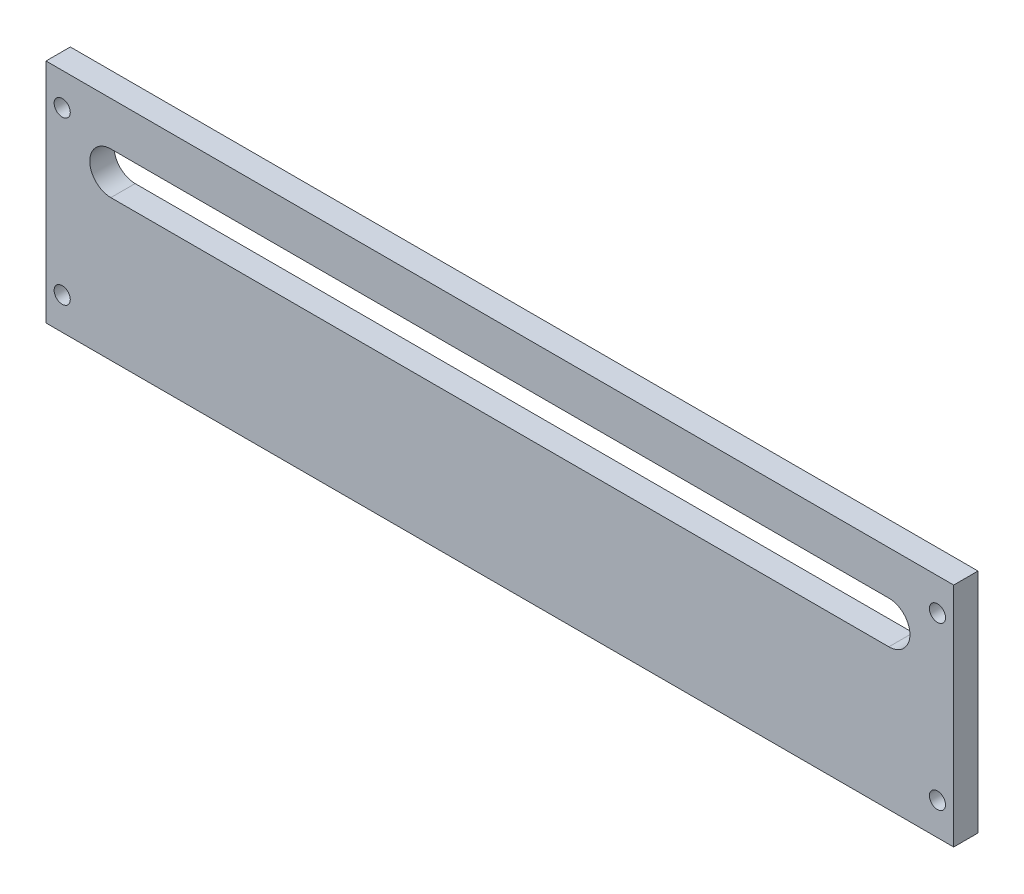
ISO-10303-21;
HEADER;
FILE_DESCRIPTION(('STEP AP214'),'2;1');
FILE_NAME('part.step','',(''),(''),'','','');
FILE_SCHEMA(('AUTOMOTIVE_DESIGN { 1 0 10303 214 1 1 1 1 }'));
ENDSEC;
DATA;
#1=APPLICATION_CONTEXT('core data for automotive mechanical design processes');
#2=APPLICATION_PROTOCOL_DEFINITION('international standard','automotive_design',2000,#1);
#3=PRODUCT_CONTEXT('',#1,'mechanical');
#4=PRODUCT('Part','Part','',(#3));
#5=PRODUCT_RELATED_PRODUCT_CATEGORY('part','',(#4));
#6=PRODUCT_DEFINITION_FORMATION('','',#4);
#7=PRODUCT_DEFINITION_CONTEXT('part definition',#1,'design');
#8=PRODUCT_DEFINITION('design','',#6,#7);
#9=PRODUCT_DEFINITION_SHAPE('','',#8);
#10=(LENGTH_UNIT() NAMED_UNIT(*) SI_UNIT(.MILLI.,.METRE.));
#11=(NAMED_UNIT(*) PLANE_ANGLE_UNIT() SI_UNIT($,.RADIAN.));
#12=(NAMED_UNIT(*) SI_UNIT($,.STERADIAN.) SOLID_ANGLE_UNIT());
#13=UNCERTAINTY_MEASURE_WITH_UNIT(LENGTH_MEASURE(1.E-05),#10,'distance_accuracy_value','');
#14=(GEOMETRIC_REPRESENTATION_CONTEXT(3) GLOBAL_UNCERTAINTY_ASSIGNED_CONTEXT((#13)) GLOBAL_UNIT_ASSIGNED_CONTEXT((#10,
#11,#12)) REPRESENTATION_CONTEXT('',''));
#15=CARTESIAN_POINT('',(0.,0.,0.));
#16=DIRECTION('',(0.,0.,1.));
#17=DIRECTION('',(1.,0.,0.));
#18=AXIS2_PLACEMENT_3D('',#15,#16,#17);
#19=CARTESIAN_POINT('',(0.,0.,9.525));
#20=DIRECTION('',(1.,0.,0.));
#21=DIRECTION('',(0.,0.,-1.));
#22=AXIS2_PLACEMENT_3D('',#19,#20,#21);
#23=PLANE('',#22);
#24=DIRECTION('',(0.,-1.,0.));
#25=VECTOR('',#24,1.);
#26=CARTESIAN_POINT('',(0.,0.,0.));
#27=LINE('',#26,#25);
#28=CARTESIAN_POINT('',(0.,88.9,0.));
#29=VERTEX_POINT('',#28);
#30=CARTESIAN_POINT('',(0.,0.,0.));
#31=VERTEX_POINT('',#30);
#32=EDGE_CURVE('E155',#29,#31,#27,.T.);
#33=ORIENTED_EDGE('',*,*,#32,.T.);
#34=DIRECTION('',(0.,0.,-1.));
#35=VECTOR('',#34,1.);
#36=CARTESIAN_POINT('',(0.,0.,9.525));
#37=LINE('',#36,#35);
#38=CARTESIAN_POINT('',(0.,0.,9.525));
#39=VERTEX_POINT('',#38);
#40=EDGE_CURVE('E11',#39,#31,#37,.T.);
#41=ORIENTED_EDGE('',*,*,#40,.F.);
#42=DIRECTION('',(0.,-1.,0.));
#43=VECTOR('',#42,1.);
#44=CARTESIAN_POINT('',(0.,0.,9.525));
#45=LINE('',#44,#43);
#46=CARTESIAN_POINT('',(0.,88.9,9.525));
#47=VERTEX_POINT('',#46);
#48=EDGE_CURVE('E158',#47,#39,#45,.T.);
#49=ORIENTED_EDGE('',*,*,#48,.F.);
#50=DIRECTION('',(0.,0.,-1.));
#51=VECTOR('',#50,1.);
#52=CARTESIAN_POINT('',(0.,88.9,9.525));
#53=LINE('',#52,#51);
#54=EDGE_CURVE('E168',#47,#29,#53,.T.);
#55=ORIENTED_EDGE('',*,*,#54,.T.);
#56=EDGE_LOOP('',(#33,#41,#49,#55));
#57=FACE_BOUND('',#56,.T.);
#58=ADVANCED_FACE('F33',(#57),#23,.F.);
#59=CARTESIAN_POINT('',(0.,0.,9.525));
#60=DIRECTION('',(0.,1.,0.));
#61=DIRECTION('',(0.,0.,1.));
#62=AXIS2_PLACEMENT_3D('',#59,#60,#61);
#63=PLANE('',#62);
#64=DIRECTION('',(1.,0.,0.));
#65=VECTOR('',#64,1.);
#66=CARTESIAN_POINT('',(0.,0.,0.));
#67=LINE('',#66,#65);
#68=CARTESIAN_POINT('',(355.6,0.,0.));
#69=VERTEX_POINT('',#68);
#70=EDGE_CURVE('E171',#31,#69,#67,.T.);
#71=ORIENTED_EDGE('',*,*,#70,.T.);
#72=DIRECTION('',(0.,0.,-1.));
#73=VECTOR('',#72,1.);
#74=CARTESIAN_POINT('',(355.6,0.,9.525));
#75=LINE('',#74,#73);
#76=CARTESIAN_POINT('',(355.6,0.,9.525));
#77=VERTEX_POINT('',#76);
#78=EDGE_CURVE('E40',#77,#69,#75,.T.);
#79=ORIENTED_EDGE('',*,*,#78,.F.);
#80=DIRECTION('',(1.,0.,0.));
#81=VECTOR('',#80,1.);
#82=CARTESIAN_POINT('',(0.,0.,9.525));
#83=LINE('',#82,#81);
#84=EDGE_CURVE('E161',#39,#77,#83,.T.);
#85=ORIENTED_EDGE('',*,*,#84,.F.);
#86=ORIENTED_EDGE('',*,*,#40,.T.);
#87=EDGE_LOOP('',(#71,#79,#85,#86));
#88=FACE_BOUND('',#87,.T.);
#89=ADVANCED_FACE('F200',(#88),#63,.F.);
#90=CARTESIAN_POINT('',(355.6,0.,9.525));
#91=DIRECTION('',(-1.,0.,0.));
#92=DIRECTION('',(0.,0.,1.));
#93=AXIS2_PLACEMENT_3D('',#90,#91,#92);
#94=PLANE('',#93);
#95=DIRECTION('',(0.,1.,0.));
#96=VECTOR('',#95,1.);
#97=CARTESIAN_POINT('',(355.6,0.,0.));
#98=LINE('',#97,#96);
#99=CARTESIAN_POINT('',(355.6,88.9,0.));
#100=VERTEX_POINT('',#99);
#101=EDGE_CURVE('E173',#69,#100,#98,.T.);
#102=ORIENTED_EDGE('',*,*,#101,.T.);
#103=DIRECTION('',(0.,0.,-1.));
#104=VECTOR('',#103,1.);
#105=CARTESIAN_POINT('',(355.6,88.9,9.525));
#106=LINE('',#105,#104);
#107=CARTESIAN_POINT('',(355.6,88.9,9.525));
#108=VERTEX_POINT('',#107);
#109=EDGE_CURVE('E178',#108,#100,#106,.T.);
#110=ORIENTED_EDGE('',*,*,#109,.F.);
#111=DIRECTION('',(0.,1.,0.));
#112=VECTOR('',#111,1.);
#113=CARTESIAN_POINT('',(355.6,0.,9.525));
#114=LINE('',#113,#112);
#115=EDGE_CURVE('E164',#77,#108,#114,.T.);
#116=ORIENTED_EDGE('',*,*,#115,.F.);
#117=ORIENTED_EDGE('',*,*,#78,.T.);
#118=EDGE_LOOP('',(#102,#110,#116,#117));
#119=FACE_BOUND('',#118,.T.);
#120=ADVANCED_FACE('F185',(#119),#94,.F.);
#121=CARTESIAN_POINT('',(0.,88.9,9.525));
#122=DIRECTION('',(0.,-1.,0.));
#123=DIRECTION('',(0.,0.,-1.));
#124=AXIS2_PLACEMENT_3D('',#121,#122,#123);
#125=PLANE('',#124);
#126=DIRECTION('',(-1.,0.,0.));
#127=VECTOR('',#126,1.);
#128=CARTESIAN_POINT('',(0.,88.9,0.));
#129=LINE('',#128,#127);
#130=EDGE_CURVE('E162',#100,#29,#129,.T.);
#131=ORIENTED_EDGE('',*,*,#130,.T.);
#132=ORIENTED_EDGE('',*,*,#54,.F.);
#133=DIRECTION('',(-1.,0.,0.));
#134=VECTOR('',#133,1.);
#135=CARTESIAN_POINT('',(0.,88.9,9.525));
#136=LINE('',#135,#134);
#137=EDGE_CURVE('E166',#108,#47,#136,.T.);
#138=ORIENTED_EDGE('',*,*,#137,.F.);
#139=ORIENTED_EDGE('',*,*,#109,.T.);
#140=EDGE_LOOP('',(#131,#132,#138,#139));
#141=FACE_BOUND('',#140,.T.);
#142=ADVANCED_FACE('F193',(#141),#125,.F.);
#143=CARTESIAN_POINT('',(0.,88.9,9.525));
#144=DIRECTION('',(0.,0.,-1.));
#145=DIRECTION('',(-1.,0.,0.));
#146=AXIS2_PLACEMENT_3D('',#143,#144,#145);
#147=PLANE('',#146);
#148=DIRECTION('',(1.,0.,0.));
#149=VECTOR('',#148,1.);
#150=CARTESIAN_POINT('',(25.4,55.245,9.525));
#151=LINE('',#150,#149);
#152=CARTESIAN_POINT('',(25.4,55.245,9.525));
#153=VERTEX_POINT('',#152);
#154=CARTESIAN_POINT('',(330.2,55.245,9.525));
#155=VERTEX_POINT('',#154);
#156=EDGE_CURVE('E124',#153,#155,#151,.T.);
#157=ORIENTED_EDGE('',*,*,#156,.F.);
#158=CARTESIAN_POINT('',(25.4,63.5,9.525));
#159=DIRECTION('',(0.,0.,1.));
#160=DIRECTION('',(1.,0.,0.));
#161=AXIS2_PLACEMENT_3D('',#158,#159,#160);
#162=CIRCLE('',#161,8.255);
#163=CARTESIAN_POINT('',(25.4,71.755,9.525));
#164=VERTEX_POINT('',#163);
#165=EDGE_CURVE('E47',#164,#153,#162,.T.);
#166=ORIENTED_EDGE('',*,*,#165,.F.);
#167=DIRECTION('',(-1.,0.,0.));
#168=VECTOR('',#167,1.);
#169=CARTESIAN_POINT('',(25.4,71.755,9.525));
#170=LINE('',#169,#168);
#171=CARTESIAN_POINT('',(330.2,71.755,9.525));
#172=VERTEX_POINT('',#171);
#173=EDGE_CURVE('E115',#172,#164,#170,.T.);
#174=ORIENTED_EDGE('',*,*,#173,.F.);
#175=CARTESIAN_POINT('',(330.2,63.5,9.525));
#176=DIRECTION('',(0.,0.,1.));
#177=DIRECTION('',(1.,0.,0.));
#178=AXIS2_PLACEMENT_3D('',#175,#176,#177);
#179=CIRCLE('',#178,8.255);
#180=EDGE_CURVE('E118',#155,#172,#179,.T.);
#181=ORIENTED_EDGE('',*,*,#180,.F.);
#182=EDGE_LOOP('',(#157,#166,#174,#181));
#183=FACE_BOUND('',#182,.T.);
#184=CARTESIAN_POINT('',(349.25,12.7,9.525));
#185=DIRECTION('',(0.,0.,1.));
#186=DIRECTION('',(1.,0.,0.));
#187=AXIS2_PLACEMENT_3D('',#184,#185,#186);
#188=CIRCLE('',#187,3.1623);
#189=CARTESIAN_POINT('',(352.4123,12.7,9.525));
#190=VERTEX_POINT('',#189);
#191=EDGE_CURVE('E130',#190,#190,#188,.T.);
#192=ORIENTED_EDGE('',*,*,#191,.F.);
#193=EDGE_LOOP('',(#192));
#194=FACE_BOUND('',#193,.T.);
#195=CARTESIAN_POINT('',(349.25,76.2,9.525));
#196=DIRECTION('',(0.,0.,1.));
#197=DIRECTION('',(1.,0.,0.));
#198=AXIS2_PLACEMENT_3D('',#195,#196,#197);
#199=CIRCLE('',#198,3.1623);
#200=CARTESIAN_POINT('',(352.4123,76.2,9.525));
#201=VERTEX_POINT('',#200);
#202=EDGE_CURVE('E137',#201,#201,#199,.T.);
#203=ORIENTED_EDGE('',*,*,#202,.F.);
#204=EDGE_LOOP('',(#203));
#205=FACE_BOUND('',#204,.T.);
#206=CARTESIAN_POINT('',(6.35,12.7,9.525));
#207=DIRECTION('',(0.,0.,1.));
#208=DIRECTION('',(1.,0.,0.));
#209=AXIS2_PLACEMENT_3D('',#206,#207,#208);
#210=CIRCLE('',#209,3.1623);
#211=CARTESIAN_POINT('',(9.5123,12.7,9.525));
#212=VERTEX_POINT('',#211);
#213=EDGE_CURVE('E143',#212,#212,#210,.T.);
#214=ORIENTED_EDGE('',*,*,#213,.F.);
#215=EDGE_LOOP('',(#214));
#216=FACE_BOUND('',#215,.T.);
#217=CARTESIAN_POINT('',(6.35,76.2,9.525));
#218=DIRECTION('',(0.,0.,1.));
#219=DIRECTION('',(1.,0.,0.));
#220=AXIS2_PLACEMENT_3D('',#217,#218,#219);
#221=CIRCLE('',#220,3.1623);
#222=CARTESIAN_POINT('',(9.5123,76.2,9.525));
#223=VERTEX_POINT('',#222);
#224=EDGE_CURVE('E149',#223,#223,#221,.T.);
#225=ORIENTED_EDGE('',*,*,#224,.F.);
#226=EDGE_LOOP('',(#225));
#227=FACE_BOUND('',#226,.T.);
#228=ORIENTED_EDGE('',*,*,#48,.T.);
#229=ORIENTED_EDGE('',*,*,#84,.T.);
#230=ORIENTED_EDGE('',*,*,#115,.T.);
#231=ORIENTED_EDGE('',*,*,#137,.T.);
#232=EDGE_LOOP('',(#228,#229,#230,#231));
#233=FACE_BOUND('',#232,.T.);
#234=ADVANCED_FACE('F199',(#183,#194,#205,#216,#227,#233),#147,.F.);
#235=CARTESIAN_POINT('',(0.,88.9,0.));
#236=DIRECTION('',(0.,0.,-1.));
#237=DIRECTION('',(-1.,0.,0.));
#238=AXIS2_PLACEMENT_3D('',#235,#236,#237);
#239=PLANE('',#238);
#240=CARTESIAN_POINT('',(25.4,63.5,0.));
#241=DIRECTION('',(0.,0.,1.));
#242=DIRECTION('',(1.,0.,0.));
#243=AXIS2_PLACEMENT_3D('',#240,#241,#242);
#244=CIRCLE('',#243,8.255);
#245=CARTESIAN_POINT('',(25.4,71.755,0.));
#246=VERTEX_POINT('',#245);
#247=CARTESIAN_POINT('',(25.4,55.245,0.));
#248=VERTEX_POINT('',#247);
#249=EDGE_CURVE('E99',#246,#248,#244,.T.);
#250=ORIENTED_EDGE('',*,*,#249,.T.);
#251=DIRECTION('',(1.,0.,0.));
#252=VECTOR('',#251,1.);
#253=CARTESIAN_POINT('',(25.4,55.245,0.));
#254=LINE('',#253,#252);
#255=CARTESIAN_POINT('',(330.2,55.245,0.));
#256=VERTEX_POINT('',#255);
#257=EDGE_CURVE('E108',#248,#256,#254,.T.);
#258=ORIENTED_EDGE('',*,*,#257,.T.);
#259=CARTESIAN_POINT('',(330.2,63.5,0.));
#260=DIRECTION('',(0.,0.,1.));
#261=DIRECTION('',(1.,0.,0.));
#262=AXIS2_PLACEMENT_3D('',#259,#260,#261);
#263=CIRCLE('',#262,8.255);
#264=CARTESIAN_POINT('',(330.2,71.755,0.));
#265=VERTEX_POINT('',#264);
#266=EDGE_CURVE('E55',#256,#265,#263,.T.);
#267=ORIENTED_EDGE('',*,*,#266,.T.);
#268=DIRECTION('',(-1.,0.,0.));
#269=VECTOR('',#268,1.);
#270=CARTESIAN_POINT('',(25.4,71.755,0.));
#271=LINE('',#270,#269);
#272=EDGE_CURVE('E105',#265,#246,#271,.T.);
#273=ORIENTED_EDGE('',*,*,#272,.T.);
#274=EDGE_LOOP('',(#250,#258,#267,#273));
#275=FACE_BOUND('',#274,.T.);
#276=CARTESIAN_POINT('',(349.25,12.7,0.));
#277=DIRECTION('',(0.,0.,1.));
#278=DIRECTION('',(1.,0.,0.));
#279=AXIS2_PLACEMENT_3D('',#276,#277,#278);
#280=CIRCLE('',#279,3.1623);
#281=CARTESIAN_POINT('',(352.4123,12.7,0.));
#282=VERTEX_POINT('',#281);
#283=EDGE_CURVE('E134',#282,#282,#280,.T.);
#284=ORIENTED_EDGE('',*,*,#283,.T.);
#285=EDGE_LOOP('',(#284));
#286=FACE_BOUND('',#285,.T.);
#287=CARTESIAN_POINT('',(349.25,76.2,0.));
#288=DIRECTION('',(0.,0.,1.));
#289=DIRECTION('',(1.,0.,0.));
#290=AXIS2_PLACEMENT_3D('',#287,#288,#289);
#291=CIRCLE('',#290,3.1623);
#292=CARTESIAN_POINT('',(352.4123,76.2,0.));
#293=VERTEX_POINT('',#292);
#294=EDGE_CURVE('E140',#293,#293,#291,.T.);
#295=ORIENTED_EDGE('',*,*,#294,.T.);
#296=EDGE_LOOP('',(#295));
#297=FACE_BOUND('',#296,.T.);
#298=CARTESIAN_POINT('',(6.35,12.7,0.));
#299=DIRECTION('',(0.,0.,1.));
#300=DIRECTION('',(1.,0.,0.));
#301=AXIS2_PLACEMENT_3D('',#298,#299,#300);
#302=CIRCLE('',#301,3.1623);
#303=CARTESIAN_POINT('',(9.5123,12.7,0.));
#304=VERTEX_POINT('',#303);
#305=EDGE_CURVE('E146',#304,#304,#302,.T.);
#306=ORIENTED_EDGE('',*,*,#305,.T.);
#307=EDGE_LOOP('',(#306));
#308=FACE_BOUND('',#307,.T.);
#309=CARTESIAN_POINT('',(6.35,76.2,0.));
#310=DIRECTION('',(0.,0.,1.));
#311=DIRECTION('',(1.,0.,0.));
#312=AXIS2_PLACEMENT_3D('',#309,#310,#311);
#313=CIRCLE('',#312,3.1623);
#314=CARTESIAN_POINT('',(9.5123,76.2,0.));
#315=VERTEX_POINT('',#314);
#316=EDGE_CURVE('E152',#315,#315,#313,.T.);
#317=ORIENTED_EDGE('',*,*,#316,.T.);
#318=EDGE_LOOP('',(#317));
#319=FACE_BOUND('',#318,.T.);
#320=ORIENTED_EDGE('',*,*,#32,.F.);
#321=ORIENTED_EDGE('',*,*,#130,.F.);
#322=ORIENTED_EDGE('',*,*,#101,.F.);
#323=ORIENTED_EDGE('',*,*,#70,.F.);
#324=EDGE_LOOP('',(#320,#321,#322,#323));
#325=FACE_BOUND('',#324,.T.);
#326=ADVANCED_FACE('F112',(#275,#286,#297,#308,#319,#325),#239,.T.);
#327=CARTESIAN_POINT('',(6.35,76.2,0.));
#328=DIRECTION('',(0.,0.,1.));
#329=DIRECTION('',(1.,0.,0.));
#330=AXIS2_PLACEMENT_3D('',#327,#328,#329);
#331=CYLINDRICAL_SURFACE('',#330,3.1623);
#332=CARTESIAN_POINT('',(9.5123,76.2,0.));
#333=CARTESIAN_POINT('',(9.5123,76.2,0.0992187499999999));
#334=CARTESIAN_POINT('',(9.5123,76.2,0.1984375));
#335=CARTESIAN_POINT('',(9.5123,76.2,0.396875));
#336=CARTESIAN_POINT('',(9.5123,76.2,0.49609375));
#337=CARTESIAN_POINT('',(9.5123,76.2,0.69453125));
#338=CARTESIAN_POINT('',(9.5123,76.2,0.79375));
#339=CARTESIAN_POINT('',(9.5123,76.2,0.9921875));
#340=CARTESIAN_POINT('',(9.5123,76.2,1.09140625));
#341=CARTESIAN_POINT('',(9.5123,76.2,1.28984375));
#342=CARTESIAN_POINT('',(9.5123,76.2,1.3890625));
#343=CARTESIAN_POINT('',(9.5123,76.2,1.5875));
#344=CARTESIAN_POINT('',(9.5123,76.2,1.68671875));
#345=CARTESIAN_POINT('',(9.5123,76.2,1.88515625));
#346=CARTESIAN_POINT('',(9.5123,76.2,1.984375));
#347=CARTESIAN_POINT('',(9.5123,76.2,2.1828125));
#348=CARTESIAN_POINT('',(9.5123,76.2,2.28203125));
#349=CARTESIAN_POINT('',(9.5123,76.2,2.48046875));
#350=CARTESIAN_POINT('',(9.5123,76.2,2.5796875));
#351=CARTESIAN_POINT('',(9.5123,76.2,2.778125));
#352=CARTESIAN_POINT('',(9.5123,76.2,2.87734375));
#353=CARTESIAN_POINT('',(9.5123,76.2,3.07578125));
#354=CARTESIAN_POINT('',(9.5123,76.2,3.175));
#355=CARTESIAN_POINT('',(9.5123,76.2,3.3734375));
#356=CARTESIAN_POINT('',(9.5123,76.2,3.47265625));
#357=CARTESIAN_POINT('',(9.5123,76.2,3.67109375));
#358=CARTESIAN_POINT('',(9.5123,76.2,3.7703125));
#359=CARTESIAN_POINT('',(9.5123,76.2,3.96875));
#360=CARTESIAN_POINT('',(9.5123,76.2,4.06796875));
#361=CARTESIAN_POINT('',(9.5123,76.2,4.26640625));
#362=CARTESIAN_POINT('',(9.5123,76.2,4.365625));
#363=CARTESIAN_POINT('',(9.5123,76.2,4.5640625));
#364=CARTESIAN_POINT('',(9.5123,76.2,4.66328125));
#365=CARTESIAN_POINT('',(9.5123,76.2,4.86171875));
#366=CARTESIAN_POINT('',(9.5123,76.2,4.9609375));
#367=CARTESIAN_POINT('',(9.5123,76.2,5.159375));
#368=CARTESIAN_POINT('',(9.5123,76.2,5.25859375));
#369=CARTESIAN_POINT('',(9.5123,76.2,5.45703125));
#370=CARTESIAN_POINT('',(9.5123,76.2,5.55625));
#371=CARTESIAN_POINT('',(9.5123,76.2,5.7546875));
#372=CARTESIAN_POINT('',(9.5123,76.2,5.85390625));
#373=CARTESIAN_POINT('',(9.5123,76.2,6.05234375));
#374=CARTESIAN_POINT('',(9.5123,76.2,6.1515625));
#375=CARTESIAN_POINT('',(9.5123,76.2,6.35));
#376=CARTESIAN_POINT('',(9.5123,76.2,6.44921875));
#377=CARTESIAN_POINT('',(9.5123,76.2,6.64765625));
#378=CARTESIAN_POINT('',(9.5123,76.2,6.746875));
#379=CARTESIAN_POINT('',(9.5123,76.2,6.9453125));
#380=CARTESIAN_POINT('',(9.5123,76.2,7.04453125));
#381=CARTESIAN_POINT('',(9.5123,76.2,7.24296875));
#382=CARTESIAN_POINT('',(9.5123,76.2,7.3421875));
#383=CARTESIAN_POINT('',(9.5123,76.2,7.540625));
#384=CARTESIAN_POINT('',(9.5123,76.2,7.63984375));
#385=CARTESIAN_POINT('',(9.5123,76.2,7.83828125));
#386=CARTESIAN_POINT('',(9.5123,76.2,7.9375));
#387=CARTESIAN_POINT('',(9.5123,76.2,8.1359375));
#388=CARTESIAN_POINT('',(9.5123,76.2,8.23515625));
#389=CARTESIAN_POINT('',(9.5123,76.2,8.43359375));
#390=CARTESIAN_POINT('',(9.5123,76.2,8.5328125));
#391=CARTESIAN_POINT('',(9.5123,76.2,8.73125));
#392=CARTESIAN_POINT('',(9.5123,76.2,8.83046875));
#393=CARTESIAN_POINT('',(9.5123,76.2,9.02890625));
#394=CARTESIAN_POINT('',(9.5123,76.2,9.128125));
#395=CARTESIAN_POINT('',(9.5123,76.2,9.3265625));
#396=CARTESIAN_POINT('',(9.5123,76.2,9.42578125));
#397=CARTESIAN_POINT('',(9.5123,76.2,9.525));
#398=B_SPLINE_CURVE_WITH_KNOTS('',3,(#332,#333,#334,#335,#336,#337,#338,#339,#340,#341,#342,
#343,#344,#345,#346,#347,#348,#349,#350,#351,#352,#353,#354,#355,#356,#357,#358,#359,#360,#361,
#362,#363,#364,#365,#366,#367,#368,#369,#370,#371,#372,#373,#374,#375,#376,#377,#378,#379,#380,
#381,#382,#383,#384,#385,#386,#387,#388,#389,#390,#391,#392,#393,#394,#395,#396,#397),
.UNSPECIFIED.,.F.,.F.,(4,2,2,2,2,2,2,2,2,2,2,2,2,2,2,2,2,2,2,2,2,2,2,2,2,2,2,2,2,2,2,2,4),(0.,
0.29765625,0.5953125,0.89296875,1.190625,1.48828125,1.7859375,2.08359375,2.38125,2.67890625,
2.9765625,3.27421875,3.571875,3.86953125,4.1671875,4.46484375,4.7625,5.06015625,5.3578125,
5.65546875,5.953125,6.25078125,6.5484375,6.84609375,7.14375,7.44140625,7.7390625,8.03671875,
8.334375,8.63203125,8.9296875,9.22734375,9.525),.UNSPECIFIED.);
#399=EDGE_CURVE('BSEAM212',#315,#223,#398,.T.);
#400=ORIENTED_EDGE('',*,*,#316,.F.);
#401=ORIENTED_EDGE('',*,*,#224,.T.);
#402=ORIENTED_EDGE('',*,*,#399,.T.);
#403=ORIENTED_EDGE('',*,*,#399,.F.);
#404=EDGE_LOOP('',(#400,#402,#401,#403));
#405=FACE_BOUND('',#404,.T.);
#406=ADVANCED_FACE('F212',(#405),#331,.F.);
#407=CARTESIAN_POINT('',(6.35,12.7,0.));
#408=DIRECTION('',(0.,0.,1.));
#409=DIRECTION('',(1.,0.,0.));
#410=AXIS2_PLACEMENT_3D('',#407,#408,#409);
#411=CYLINDRICAL_SURFACE('',#410,3.1623);
#412=CARTESIAN_POINT('',(9.5123,12.7,0.));
#413=CARTESIAN_POINT('',(9.5123,12.7,0.0992187499999999));
#414=CARTESIAN_POINT('',(9.5123,12.7,0.1984375));
#415=CARTESIAN_POINT('',(9.5123,12.7,0.396875));
#416=CARTESIAN_POINT('',(9.5123,12.7,0.49609375));
#417=CARTESIAN_POINT('',(9.5123,12.7,0.69453125));
#418=CARTESIAN_POINT('',(9.5123,12.7,0.79375));
#419=CARTESIAN_POINT('',(9.5123,12.7,0.9921875));
#420=CARTESIAN_POINT('',(9.5123,12.7,1.09140625));
#421=CARTESIAN_POINT('',(9.5123,12.7,1.28984375));
#422=CARTESIAN_POINT('',(9.5123,12.7,1.3890625));
#423=CARTESIAN_POINT('',(9.5123,12.7,1.5875));
#424=CARTESIAN_POINT('',(9.5123,12.7,1.68671875));
#425=CARTESIAN_POINT('',(9.5123,12.7,1.88515625));
#426=CARTESIAN_POINT('',(9.5123,12.7,1.984375));
#427=CARTESIAN_POINT('',(9.5123,12.7,2.1828125));
#428=CARTESIAN_POINT('',(9.5123,12.7,2.28203125));
#429=CARTESIAN_POINT('',(9.5123,12.7,2.48046875));
#430=CARTESIAN_POINT('',(9.5123,12.7,2.5796875));
#431=CARTESIAN_POINT('',(9.5123,12.7,2.778125));
#432=CARTESIAN_POINT('',(9.5123,12.7,2.87734375));
#433=CARTESIAN_POINT('',(9.5123,12.7,3.07578125));
#434=CARTESIAN_POINT('',(9.5123,12.7,3.175));
#435=CARTESIAN_POINT('',(9.5123,12.7,3.3734375));
#436=CARTESIAN_POINT('',(9.5123,12.7,3.47265625));
#437=CARTESIAN_POINT('',(9.5123,12.7,3.67109375));
#438=CARTESIAN_POINT('',(9.5123,12.7,3.7703125));
#439=CARTESIAN_POINT('',(9.5123,12.7,3.96875));
#440=CARTESIAN_POINT('',(9.5123,12.7,4.06796875));
#441=CARTESIAN_POINT('',(9.5123,12.7,4.26640625));
#442=CARTESIAN_POINT('',(9.5123,12.7,4.365625));
#443=CARTESIAN_POINT('',(9.5123,12.7,4.5640625));
#444=CARTESIAN_POINT('',(9.5123,12.7,4.66328125));
#445=CARTESIAN_POINT('',(9.5123,12.7,4.86171875));
#446=CARTESIAN_POINT('',(9.5123,12.7,4.9609375));
#447=CARTESIAN_POINT('',(9.5123,12.7,5.159375));
#448=CARTESIAN_POINT('',(9.5123,12.7,5.25859375));
#449=CARTESIAN_POINT('',(9.5123,12.7,5.45703125));
#450=CARTESIAN_POINT('',(9.5123,12.7,5.55625));
#451=CARTESIAN_POINT('',(9.5123,12.7,5.7546875));
#452=CARTESIAN_POINT('',(9.5123,12.7,5.85390625));
#453=CARTESIAN_POINT('',(9.5123,12.7,6.05234375));
#454=CARTESIAN_POINT('',(9.5123,12.7,6.1515625));
#455=CARTESIAN_POINT('',(9.5123,12.7,6.35));
#456=CARTESIAN_POINT('',(9.5123,12.7,6.44921875));
#457=CARTESIAN_POINT('',(9.5123,12.7,6.64765625));
#458=CARTESIAN_POINT('',(9.5123,12.7,6.746875));
#459=CARTESIAN_POINT('',(9.5123,12.7,6.9453125));
#460=CARTESIAN_POINT('',(9.5123,12.7,7.04453125));
#461=CARTESIAN_POINT('',(9.5123,12.7,7.24296875));
#462=CARTESIAN_POINT('',(9.5123,12.7,7.3421875));
#463=CARTESIAN_POINT('',(9.5123,12.7,7.540625));
#464=CARTESIAN_POINT('',(9.5123,12.7,7.63984375));
#465=CARTESIAN_POINT('',(9.5123,12.7,7.83828125));
#466=CARTESIAN_POINT('',(9.5123,12.7,7.9375));
#467=CARTESIAN_POINT('',(9.5123,12.7,8.1359375));
#468=CARTESIAN_POINT('',(9.5123,12.7,8.23515625));
#469=CARTESIAN_POINT('',(9.5123,12.7,8.43359375));
#470=CARTESIAN_POINT('',(9.5123,12.7,8.5328125));
#471=CARTESIAN_POINT('',(9.5123,12.7,8.73125));
#472=CARTESIAN_POINT('',(9.5123,12.7,8.83046875));
#473=CARTESIAN_POINT('',(9.5123,12.7,9.02890625));
#474=CARTESIAN_POINT('',(9.5123,12.7,9.128125));
#475=CARTESIAN_POINT('',(9.5123,12.7,9.3265625));
#476=CARTESIAN_POINT('',(9.5123,12.7,9.42578125));
#477=CARTESIAN_POINT('',(9.5123,12.7,9.525));
#478=B_SPLINE_CURVE_WITH_KNOTS('',3,(#412,#413,#414,#415,#416,#417,#418,#419,#420,#421,#422,
#423,#424,#425,#426,#427,#428,#429,#430,#431,#432,#433,#434,#435,#436,#437,#438,#439,#440,#441,
#442,#443,#444,#445,#446,#447,#448,#449,#450,#451,#452,#453,#454,#455,#456,#457,#458,#459,#460,
#461,#462,#463,#464,#465,#466,#467,#468,#469,#470,#471,#472,#473,#474,#475,#476,#477),
.UNSPECIFIED.,.F.,.F.,(4,2,2,2,2,2,2,2,2,2,2,2,2,2,2,2,2,2,2,2,2,2,2,2,2,2,2,2,2,2,2,2,4),(0.,
0.29765625,0.5953125,0.89296875,1.190625,1.48828125,1.7859375,2.08359375,2.38125,2.67890625,
2.9765625,3.27421875,3.571875,3.86953125,4.1671875,4.46484375,4.7625,5.06015625,5.3578125,
5.65546875,5.953125,6.25078125,6.5484375,6.84609375,7.14375,7.44140625,7.7390625,8.03671875,
8.334375,8.63203125,8.9296875,9.22734375,9.525),.UNSPECIFIED.);
#479=EDGE_CURVE('BSEAM218',#304,#212,#478,.T.);
#480=ORIENTED_EDGE('',*,*,#305,.F.);
#481=ORIENTED_EDGE('',*,*,#213,.T.);
#482=ORIENTED_EDGE('',*,*,#479,.T.);
#483=ORIENTED_EDGE('',*,*,#479,.F.);
#484=EDGE_LOOP('',(#480,#482,#481,#483));
#485=FACE_BOUND('',#484,.T.);
#486=ADVANCED_FACE('F218',(#485),#411,.F.);
#487=CARTESIAN_POINT('',(349.25,76.2,0.));
#488=DIRECTION('',(0.,0.,1.));
#489=DIRECTION('',(1.,0.,0.));
#490=AXIS2_PLACEMENT_3D('',#487,#488,#489);
#491=CYLINDRICAL_SURFACE('',#490,3.1623);
#492=CARTESIAN_POINT('',(352.4123,76.2,0.));
#493=CARTESIAN_POINT('',(352.4123,76.2,0.0992187499999999));
#494=CARTESIAN_POINT('',(352.4123,76.2,0.1984375));
#495=CARTESIAN_POINT('',(352.4123,76.2,0.396875));
#496=CARTESIAN_POINT('',(352.4123,76.2,0.49609375));
#497=CARTESIAN_POINT('',(352.4123,76.2,0.69453125));
#498=CARTESIAN_POINT('',(352.4123,76.2,0.79375));
#499=CARTESIAN_POINT('',(352.4123,76.2,0.9921875));
#500=CARTESIAN_POINT('',(352.4123,76.2,1.09140625));
#501=CARTESIAN_POINT('',(352.4123,76.2,1.28984375));
#502=CARTESIAN_POINT('',(352.4123,76.2,1.3890625));
#503=CARTESIAN_POINT('',(352.4123,76.2,1.5875));
#504=CARTESIAN_POINT('',(352.4123,76.2,1.68671875));
#505=CARTESIAN_POINT('',(352.4123,76.2,1.88515625));
#506=CARTESIAN_POINT('',(352.4123,76.2,1.984375));
#507=CARTESIAN_POINT('',(352.4123,76.2,2.1828125));
#508=CARTESIAN_POINT('',(352.4123,76.2,2.28203125));
#509=CARTESIAN_POINT('',(352.4123,76.2,2.48046875));
#510=CARTESIAN_POINT('',(352.4123,76.2,2.5796875));
#511=CARTESIAN_POINT('',(352.4123,76.2,2.778125));
#512=CARTESIAN_POINT('',(352.4123,76.2,2.87734375));
#513=CARTESIAN_POINT('',(352.4123,76.2,3.07578125));
#514=CARTESIAN_POINT('',(352.4123,76.2,3.175));
#515=CARTESIAN_POINT('',(352.4123,76.2,3.3734375));
#516=CARTESIAN_POINT('',(352.4123,76.2,3.47265625));
#517=CARTESIAN_POINT('',(352.4123,76.2,3.67109375));
#518=CARTESIAN_POINT('',(352.4123,76.2,3.7703125));
#519=CARTESIAN_POINT('',(352.4123,76.2,3.96875));
#520=CARTESIAN_POINT('',(352.4123,76.2,4.06796875));
#521=CARTESIAN_POINT('',(352.4123,76.2,4.26640625));
#522=CARTESIAN_POINT('',(352.4123,76.2,4.365625));
#523=CARTESIAN_POINT('',(352.4123,76.2,4.5640625));
#524=CARTESIAN_POINT('',(352.4123,76.2,4.66328125));
#525=CARTESIAN_POINT('',(352.4123,76.2,4.86171875));
#526=CARTESIAN_POINT('',(352.4123,76.2,4.9609375));
#527=CARTESIAN_POINT('',(352.4123,76.2,5.159375));
#528=CARTESIAN_POINT('',(352.4123,76.2,5.25859375));
#529=CARTESIAN_POINT('',(352.4123,76.2,5.45703125));
#530=CARTESIAN_POINT('',(352.4123,76.2,5.55625));
#531=CARTESIAN_POINT('',(352.4123,76.2,5.7546875));
#532=CARTESIAN_POINT('',(352.4123,76.2,5.85390625));
#533=CARTESIAN_POINT('',(352.4123,76.2,6.05234375));
#534=CARTESIAN_POINT('',(352.4123,76.2,6.1515625));
#535=CARTESIAN_POINT('',(352.4123,76.2,6.35));
#536=CARTESIAN_POINT('',(352.4123,76.2,6.44921875));
#537=CARTESIAN_POINT('',(352.4123,76.2,6.64765625));
#538=CARTESIAN_POINT('',(352.4123,76.2,6.746875));
#539=CARTESIAN_POINT('',(352.4123,76.2,6.9453125));
#540=CARTESIAN_POINT('',(352.4123,76.2,7.04453125));
#541=CARTESIAN_POINT('',(352.4123,76.2,7.24296875));
#542=CARTESIAN_POINT('',(352.4123,76.2,7.3421875));
#543=CARTESIAN_POINT('',(352.4123,76.2,7.540625));
#544=CARTESIAN_POINT('',(352.4123,76.2,7.63984375));
#545=CARTESIAN_POINT('',(352.4123,76.2,7.83828125));
#546=CARTESIAN_POINT('',(352.4123,76.2,7.9375));
#547=CARTESIAN_POINT('',(352.4123,76.2,8.1359375));
#548=CARTESIAN_POINT('',(352.4123,76.2,8.23515625));
#549=CARTESIAN_POINT('',(352.4123,76.2,8.43359375));
#550=CARTESIAN_POINT('',(352.4123,76.2,8.5328125));
#551=CARTESIAN_POINT('',(352.4123,76.2,8.73125));
#552=CARTESIAN_POINT('',(352.4123,76.2,8.83046875));
#553=CARTESIAN_POINT('',(352.4123,76.2,9.02890625));
#554=CARTESIAN_POINT('',(352.4123,76.2,9.128125));
#555=CARTESIAN_POINT('',(352.4123,76.2,9.3265625));
#556=CARTESIAN_POINT('',(352.4123,76.2,9.42578125));
#557=CARTESIAN_POINT('',(352.4123,76.2,9.525));
#558=B_SPLINE_CURVE_WITH_KNOTS('',3,(#492,#493,#494,#495,#496,#497,#498,#499,#500,#501,#502,
#503,#504,#505,#506,#507,#508,#509,#510,#511,#512,#513,#514,#515,#516,#517,#518,#519,#520,#521,
#522,#523,#524,#525,#526,#527,#528,#529,#530,#531,#532,#533,#534,#535,#536,#537,#538,#539,#540,
#541,#542,#543,#544,#545,#546,#547,#548,#549,#550,#551,#552,#553,#554,#555,#556,#557),
.UNSPECIFIED.,.F.,.F.,(4,2,2,2,2,2,2,2,2,2,2,2,2,2,2,2,2,2,2,2,2,2,2,2,2,2,2,2,2,2,2,2,4),(0.,
0.29765625,0.5953125,0.89296875,1.190625,1.48828125,1.7859375,2.08359375,2.38125,2.67890625,
2.9765625,3.27421875,3.571875,3.86953125,4.1671875,4.46484375,4.7625,5.06015625,5.3578125,
5.65546875,5.953125,6.25078125,6.5484375,6.84609375,7.14375,7.44140625,7.7390625,8.03671875,
8.334375,8.63203125,8.9296875,9.22734375,9.525),.UNSPECIFIED.);
#559=EDGE_CURVE('BSEAM222',#293,#201,#558,.T.);
#560=ORIENTED_EDGE('',*,*,#294,.F.);
#561=ORIENTED_EDGE('',*,*,#202,.T.);
#562=ORIENTED_EDGE('',*,*,#559,.T.);
#563=ORIENTED_EDGE('',*,*,#559,.F.);
#564=EDGE_LOOP('',(#560,#562,#561,#563));
#565=FACE_BOUND('',#564,.T.);
#566=ADVANCED_FACE('F222',(#565),#491,.F.);
#567=CARTESIAN_POINT('',(349.25,12.7,0.));
#568=DIRECTION('',(0.,0.,1.));
#569=DIRECTION('',(1.,0.,0.));
#570=AXIS2_PLACEMENT_3D('',#567,#568,#569);
#571=CYLINDRICAL_SURFACE('',#570,3.1623);
#572=CARTESIAN_POINT('',(352.4123,12.7,0.));
#573=CARTESIAN_POINT('',(352.4123,12.7,0.0992187499999999));
#574=CARTESIAN_POINT('',(352.4123,12.7,0.1984375));
#575=CARTESIAN_POINT('',(352.4123,12.7,0.396875));
#576=CARTESIAN_POINT('',(352.4123,12.7,0.49609375));
#577=CARTESIAN_POINT('',(352.4123,12.7,0.69453125));
#578=CARTESIAN_POINT('',(352.4123,12.7,0.79375));
#579=CARTESIAN_POINT('',(352.4123,12.7,0.9921875));
#580=CARTESIAN_POINT('',(352.4123,12.7,1.09140625));
#581=CARTESIAN_POINT('',(352.4123,12.7,1.28984375));
#582=CARTESIAN_POINT('',(352.4123,12.7,1.3890625));
#583=CARTESIAN_POINT('',(352.4123,12.7,1.5875));
#584=CARTESIAN_POINT('',(352.4123,12.7,1.68671875));
#585=CARTESIAN_POINT('',(352.4123,12.7,1.88515625));
#586=CARTESIAN_POINT('',(352.4123,12.7,1.984375));
#587=CARTESIAN_POINT('',(352.4123,12.7,2.1828125));
#588=CARTESIAN_POINT('',(352.4123,12.7,2.28203125));
#589=CARTESIAN_POINT('',(352.4123,12.7,2.48046875));
#590=CARTESIAN_POINT('',(352.4123,12.7,2.5796875));
#591=CARTESIAN_POINT('',(352.4123,12.7,2.778125));
#592=CARTESIAN_POINT('',(352.4123,12.7,2.87734375));
#593=CARTESIAN_POINT('',(352.4123,12.7,3.07578125));
#594=CARTESIAN_POINT('',(352.4123,12.7,3.175));
#595=CARTESIAN_POINT('',(352.4123,12.7,3.3734375));
#596=CARTESIAN_POINT('',(352.4123,12.7,3.47265625));
#597=CARTESIAN_POINT('',(352.4123,12.7,3.67109375));
#598=CARTESIAN_POINT('',(352.4123,12.7,3.7703125));
#599=CARTESIAN_POINT('',(352.4123,12.7,3.96875));
#600=CARTESIAN_POINT('',(352.4123,12.7,4.06796875));
#601=CARTESIAN_POINT('',(352.4123,12.7,4.26640625));
#602=CARTESIAN_POINT('',(352.4123,12.7,4.365625));
#603=CARTESIAN_POINT('',(352.4123,12.7,4.5640625));
#604=CARTESIAN_POINT('',(352.4123,12.7,4.66328125));
#605=CARTESIAN_POINT('',(352.4123,12.7,4.86171875));
#606=CARTESIAN_POINT('',(352.4123,12.7,4.9609375));
#607=CARTESIAN_POINT('',(352.4123,12.7,5.159375));
#608=CARTESIAN_POINT('',(352.4123,12.7,5.25859375));
#609=CARTESIAN_POINT('',(352.4123,12.7,5.45703125));
#610=CARTESIAN_POINT('',(352.4123,12.7,5.55625));
#611=CARTESIAN_POINT('',(352.4123,12.7,5.7546875));
#612=CARTESIAN_POINT('',(352.4123,12.7,5.85390625));
#613=CARTESIAN_POINT('',(352.4123,12.7,6.05234375));
#614=CARTESIAN_POINT('',(352.4123,12.7,6.1515625));
#615=CARTESIAN_POINT('',(352.4123,12.7,6.35));
#616=CARTESIAN_POINT('',(352.4123,12.7,6.44921875));
#617=CARTESIAN_POINT('',(352.4123,12.7,6.64765625));
#618=CARTESIAN_POINT('',(352.4123,12.7,6.746875));
#619=CARTESIAN_POINT('',(352.4123,12.7,6.9453125));
#620=CARTESIAN_POINT('',(352.4123,12.7,7.04453125));
#621=CARTESIAN_POINT('',(352.4123,12.7,7.24296875));
#622=CARTESIAN_POINT('',(352.4123,12.7,7.3421875));
#623=CARTESIAN_POINT('',(352.4123,12.7,7.540625));
#624=CARTESIAN_POINT('',(352.4123,12.7,7.63984375));
#625=CARTESIAN_POINT('',(352.4123,12.7,7.83828125));
#626=CARTESIAN_POINT('',(352.4123,12.7,7.9375));
#627=CARTESIAN_POINT('',(352.4123,12.7,8.1359375));
#628=CARTESIAN_POINT('',(352.4123,12.7,8.23515625));
#629=CARTESIAN_POINT('',(352.4123,12.7,8.43359375));
#630=CARTESIAN_POINT('',(352.4123,12.7,8.5328125));
#631=CARTESIAN_POINT('',(352.4123,12.7,8.73125));
#632=CARTESIAN_POINT('',(352.4123,12.7,8.83046875));
#633=CARTESIAN_POINT('',(352.4123,12.7,9.02890625));
#634=CARTESIAN_POINT('',(352.4123,12.7,9.128125));
#635=CARTESIAN_POINT('',(352.4123,12.7,9.3265625));
#636=CARTESIAN_POINT('',(352.4123,12.7,9.42578125));
#637=CARTESIAN_POINT('',(352.4123,12.7,9.525));
#638=B_SPLINE_CURVE_WITH_KNOTS('',3,(#572,#573,#574,#575,#576,#577,#578,#579,#580,#581,#582,
#583,#584,#585,#586,#587,#588,#589,#590,#591,#592,#593,#594,#595,#596,#597,#598,#599,#600,#601,
#602,#603,#604,#605,#606,#607,#608,#609,#610,#611,#612,#613,#614,#615,#616,#617,#618,#619,#620,
#621,#622,#623,#624,#625,#626,#627,#628,#629,#630,#631,#632,#633,#634,#635,#636,#637),
.UNSPECIFIED.,.F.,.F.,(4,2,2,2,2,2,2,2,2,2,2,2,2,2,2,2,2,2,2,2,2,2,2,2,2,2,2,2,2,2,2,2,4),(0.,
0.29765625,0.5953125,0.89296875,1.190625,1.48828125,1.7859375,2.08359375,2.38125,2.67890625,
2.9765625,3.27421875,3.571875,3.86953125,4.1671875,4.46484375,4.7625,5.06015625,5.3578125,
5.65546875,5.953125,6.25078125,6.5484375,6.84609375,7.14375,7.44140625,7.7390625,8.03671875,
8.334375,8.63203125,8.9296875,9.22734375,9.525),.UNSPECIFIED.);
#639=EDGE_CURVE('BSEAM226',#282,#190,#638,.T.);
#640=ORIENTED_EDGE('',*,*,#283,.F.);
#641=ORIENTED_EDGE('',*,*,#191,.T.);
#642=ORIENTED_EDGE('',*,*,#639,.T.);
#643=ORIENTED_EDGE('',*,*,#639,.F.);
#644=EDGE_LOOP('',(#640,#642,#641,#643));
#645=FACE_BOUND('',#644,.T.);
#646=ADVANCED_FACE('F226',(#645),#571,.F.);
#647=CARTESIAN_POINT('',(25.4,63.5,0.));
#648=DIRECTION('',(0.,0.,1.));
#649=DIRECTION('',(1.,0.,0.));
#650=AXIS2_PLACEMENT_3D('',#647,#648,#649);
#651=CYLINDRICAL_SURFACE('',#650,8.255);
#652=ORIENTED_EDGE('',*,*,#165,.T.);
#653=DIRECTION('',(0.,0.,1.));
#654=VECTOR('',#653,1.);
#655=CARTESIAN_POINT('',(25.4,55.245,0.));
#656=LINE('',#655,#654);
#657=EDGE_CURVE('E95',#248,#153,#656,.T.);
#658=ORIENTED_EDGE('',*,*,#657,.F.);
#659=ORIENTED_EDGE('',*,*,#249,.F.);
#660=DIRECTION('',(0.,0.,1.));
#661=VECTOR('',#660,1.);
#662=CARTESIAN_POINT('',(25.4,71.755,0.));
#663=LINE('',#662,#661);
#664=EDGE_CURVE('E128',#246,#164,#663,.T.);
#665=ORIENTED_EDGE('',*,*,#664,.T.);
#666=EDGE_LOOP('',(#652,#658,#659,#665));
#667=FACE_BOUND('',#666,.T.);
#668=ADVANCED_FACE('F97',(#667),#651,.F.);
#669=CARTESIAN_POINT('',(25.4,71.755,0.));
#670=DIRECTION('',(0.,1.,0.));
#671=DIRECTION('',(0.,0.,1.));
#672=AXIS2_PLACEMENT_3D('',#669,#670,#671);
#673=PLANE('',#672);
#674=ORIENTED_EDGE('',*,*,#173,.T.);
#675=ORIENTED_EDGE('',*,*,#664,.F.);
#676=ORIENTED_EDGE('',*,*,#272,.F.);
#677=DIRECTION('',(0.,0.,1.));
#678=VECTOR('',#677,1.);
#679=CARTESIAN_POINT('',(330.2,71.755,0.));
#680=LINE('',#679,#678);
#681=EDGE_CURVE('E131',#265,#172,#680,.T.);
#682=ORIENTED_EDGE('',*,*,#681,.T.);
#683=EDGE_LOOP('',(#674,#675,#676,#682));
#684=FACE_BOUND('',#683,.T.);
#685=ADVANCED_FACE('F233',(#684),#673,.F.);
#686=CARTESIAN_POINT('',(330.2,63.5,0.));
#687=DIRECTION('',(0.,0.,1.));
#688=DIRECTION('',(1.,0.,0.));
#689=AXIS2_PLACEMENT_3D('',#686,#687,#688);
#690=CYLINDRICAL_SURFACE('',#689,8.255);
#691=ORIENTED_EDGE('',*,*,#180,.T.);
#692=ORIENTED_EDGE('',*,*,#681,.F.);
#693=ORIENTED_EDGE('',*,*,#266,.F.);
#694=DIRECTION('',(0.,0.,1.));
#695=VECTOR('',#694,1.);
#696=CARTESIAN_POINT('',(330.2,55.245,0.));
#697=LINE('',#696,#695);
#698=EDGE_CURVE('E104',#256,#155,#697,.T.);
#699=ORIENTED_EDGE('',*,*,#698,.T.);
#700=EDGE_LOOP('',(#691,#692,#693,#699));
#701=FACE_BOUND('',#700,.T.);
#702=ADVANCED_FACE('F236',(#701),#690,.F.);
#703=CARTESIAN_POINT('',(25.4,55.245,0.));
#704=DIRECTION('',(0.,-1.,0.));
#705=DIRECTION('',(0.,0.,-1.));
#706=AXIS2_PLACEMENT_3D('',#703,#704,#705);
#707=PLANE('',#706);
#708=ORIENTED_EDGE('',*,*,#156,.T.);
#709=ORIENTED_EDGE('',*,*,#698,.F.);
#710=ORIENTED_EDGE('',*,*,#257,.F.);
#711=ORIENTED_EDGE('',*,*,#657,.T.);
#712=EDGE_LOOP('',(#708,#709,#710,#711));
#713=FACE_BOUND('',#712,.T.);
#714=ADVANCED_FACE('F109',(#713),#707,.F.);
#715=CLOSED_SHELL('',(#58,#89,#120,#142,#234,#326,#406,#486,#566,#646,#668,#685,#702,#714));
#716=MANIFOLD_SOLID_BREP('B2',#715);
#717=ADVANCED_BREP_SHAPE_REPRESENTATION('',(#18,#716),#14);
#718=SHAPE_DEFINITION_REPRESENTATION(#9,#717);
ENDSEC;
END-ISO-10303-21;
